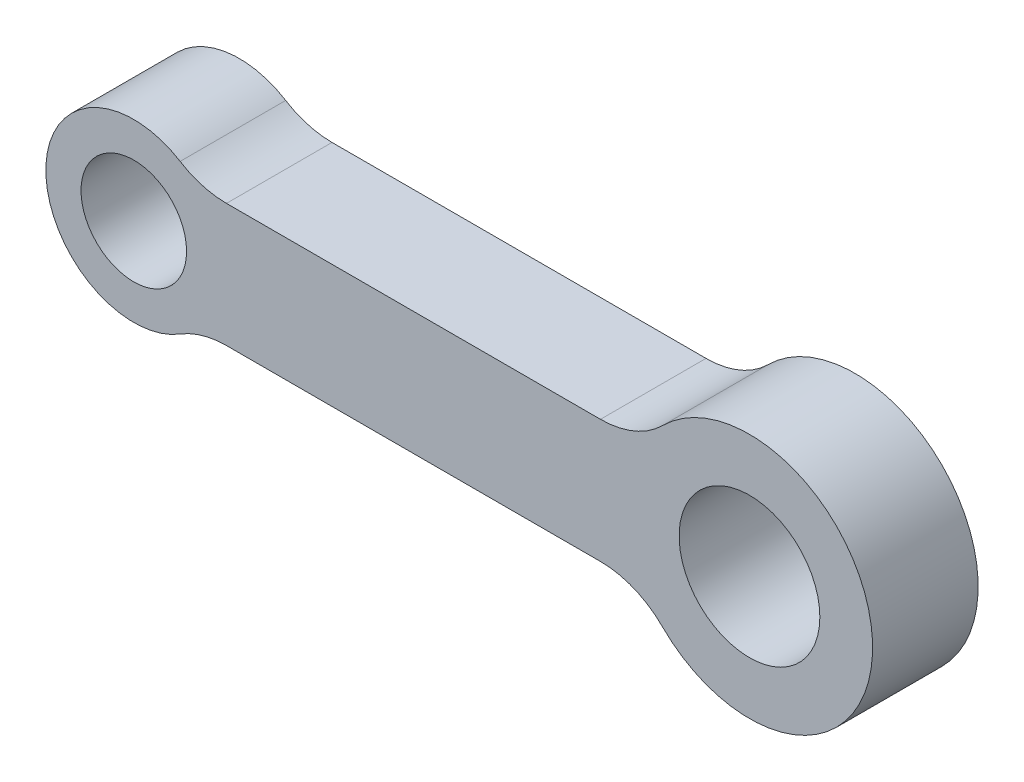
ISO-10303-21;
HEADER;
FILE_DESCRIPTION(('STEP AP214'),'2;1');
FILE_NAME('part.step','',(''),(''),'','','');
FILE_SCHEMA(('AUTOMOTIVE_DESIGN { 1 0 10303 214 1 1 1 1 }'));
ENDSEC;
DATA;
#1=APPLICATION_CONTEXT('core data for automotive mechanical design processes');
#2=APPLICATION_PROTOCOL_DEFINITION('international standard','automotive_design',2000,#1);
#3=PRODUCT_CONTEXT('',#1,'mechanical');
#4=PRODUCT('Part','Part','',(#3));
#5=PRODUCT_RELATED_PRODUCT_CATEGORY('part','',(#4));
#6=PRODUCT_DEFINITION_FORMATION('','',#4);
#7=PRODUCT_DEFINITION_CONTEXT('part definition',#1,'design');
#8=PRODUCT_DEFINITION('design','',#6,#7);
#9=PRODUCT_DEFINITION_SHAPE('','',#8);
#10=(LENGTH_UNIT() NAMED_UNIT(*) SI_UNIT(.MILLI.,.METRE.));
#11=(NAMED_UNIT(*) PLANE_ANGLE_UNIT() SI_UNIT($,.RADIAN.));
#12=(NAMED_UNIT(*) SI_UNIT($,.STERADIAN.) SOLID_ANGLE_UNIT());
#13=UNCERTAINTY_MEASURE_WITH_UNIT(LENGTH_MEASURE(1.E-05),#10,'distance_accuracy_value','');
#14=(GEOMETRIC_REPRESENTATION_CONTEXT(3) GLOBAL_UNCERTAINTY_ASSIGNED_CONTEXT((#13)) GLOBAL_UNIT_ASSIGNED_CONTEXT((#10,
#11,#12)) REPRESENTATION_CONTEXT('',''));
#15=CARTESIAN_POINT('',(0.,0.,0.));
#16=DIRECTION('',(0.,0.,1.));
#17=DIRECTION('',(1.,0.,0.));
#18=AXIS2_PLACEMENT_3D('',#15,#16,#17);
#19=CARTESIAN_POINT('',(-17.5,0.,3.));
#20=DIRECTION('',(0.,0.,-1.));
#21=DIRECTION('',(-1.,0.,0.));
#22=AXIS2_PLACEMENT_3D('',#19,#20,#21);
#23=CYLINDRICAL_SURFACE('',#22,5.);
#24=CARTESIAN_POINT('',(-17.5,0.,3.));
#25=DIRECTION('',(0.,0.,1.));
#26=DIRECTION('',(1.,0.,0.));
#27=AXIS2_PLACEMENT_3D('',#24,#25,#26);
#28=CIRCLE('',#27,5.);
#29=CARTESIAN_POINT('',(-14.8660865617868,4.25,3.));
#30=VERTEX_POINT('',#29);
#31=CARTESIAN_POINT('',(-14.8660865617868,-4.25,3.));
#32=VERTEX_POINT('',#31);
#33=EDGE_CURVE('E192',#30,#32,#28,.T.);
#34=ORIENTED_EDGE('',*,*,#33,.F.);
#35=DIRECTION('',(0.,0.,-1.));
#36=VECTOR('',#35,1.);
#37=CARTESIAN_POINT('',(-14.8660865617868,4.25,3.));
#38=LINE('',#37,#36);
#39=CARTESIAN_POINT('',(-14.8660865617868,4.25,-3.));
#40=VERTEX_POINT('',#39);
#41=EDGE_CURVE('E155',#30,#40,#38,.T.);
#42=ORIENTED_EDGE('',*,*,#41,.T.);
#43=CARTESIAN_POINT('',(-17.5,0.,-3.));
#44=DIRECTION('',(0.,0.,1.));
#45=DIRECTION('',(1.,0.,0.));
#46=AXIS2_PLACEMENT_3D('',#43,#44,#45);
#47=CIRCLE('',#46,5.);
#48=CARTESIAN_POINT('',(-14.8660865617868,-4.25,-3.));
#49=VERTEX_POINT('',#48);
#50=EDGE_CURVE('E111',#40,#49,#47,.T.);
#51=ORIENTED_EDGE('',*,*,#50,.T.);
#52=DIRECTION('',(0.,0.,-1.));
#53=VECTOR('',#52,1.);
#54=CARTESIAN_POINT('',(-14.8660865617868,-4.25,3.));
#55=LINE('',#54,#53);
#56=EDGE_CURVE('E152',#49,#32,#55,.F.);
#57=ORIENTED_EDGE('',*,*,#56,.T.);
#58=EDGE_LOOP('',(#34,#42,#51,#57));
#59=FACE_BOUND('',#58,.T.);
#60=ADVANCED_FACE('F39',(#59),#23,.T.);
#61=CARTESIAN_POINT('',(0.,-3.5,3.));
#62=DIRECTION('',(0.,1.,0.));
#63=DIRECTION('',(0.,0.,1.));
#64=AXIS2_PLACEMENT_3D('',#61,#62,#63);
#65=PLANE('',#64);
#66=DIRECTION('',(1.,0.,0.));
#67=VECTOR('',#66,1.);
#68=CARTESIAN_POINT('',(0.,-3.5,-3.));
#69=LINE('',#68,#67);
#70=CARTESIAN_POINT('',(-12.2321731235736,-3.5,-3.));
#71=VERTEX_POINT('',#70);
#72=CARTESIAN_POINT('',(9.02946282695129,-3.5,-3.));
#73=VERTEX_POINT('',#72);
#74=EDGE_CURVE('E178',#71,#73,#69,.T.);
#75=ORIENTED_EDGE('',*,*,#74,.T.);
#76=DIRECTION('',(0.,0.,1.));
#77=VECTOR('',#76,1.);
#78=CARTESIAN_POINT('',(9.02946282695129,-3.5,3.));
#79=LINE('',#78,#77);
#80=CARTESIAN_POINT('',(9.02946282695129,-3.5,3.));
#81=VERTEX_POINT('',#80);
#82=EDGE_CURVE('E55',#73,#81,#79,.T.);
#83=ORIENTED_EDGE('',*,*,#82,.T.);
#84=DIRECTION('',(1.,0.,0.));
#85=VECTOR('',#84,1.);
#86=CARTESIAN_POINT('',(0.,-3.5,3.));
#87=LINE('',#86,#85);
#88=CARTESIAN_POINT('',(-12.2321731235736,-3.5,3.));
#89=VERTEX_POINT('',#88);
#90=EDGE_CURVE('E188',#89,#81,#87,.T.);
#91=ORIENTED_EDGE('',*,*,#90,.F.);
#92=DIRECTION('',(0.,0.,1.));
#93=VECTOR('',#92,1.);
#94=CARTESIAN_POINT('',(-12.2321731235736,-3.5,-3.));
#95=LINE('',#94,#93);
#96=EDGE_CURVE('E158',#89,#71,#95,.F.);
#97=ORIENTED_EDGE('',*,*,#96,.T.);
#98=EDGE_LOOP('',(#75,#83,#91,#97));
#99=FACE_BOUND('',#98,.T.);
#100=ADVANCED_FACE('F187',(#99),#65,.F.);
#101=CARTESIAN_POINT('',(17.5,0.,3.));
#102=DIRECTION('',(0.,0.,-1.));
#103=DIRECTION('',(-1.,0.,0.));
#104=AXIS2_PLACEMENT_3D('',#101,#102,#103);
#105=CYLINDRICAL_SURFACE('',#104,7.);
#106=CARTESIAN_POINT('',(17.5,0.,-3.));
#107=DIRECTION('',(0.,0.,1.));
#108=DIRECTION('',(1.,0.,0.));
#109=AXIS2_PLACEMENT_3D('',#106,#107,#108);
#110=CIRCLE('',#109,7.);
#111=CARTESIAN_POINT('',(12.5588533157216,-4.95833333333333,-3.));
#112=VERTEX_POINT('',#111);
#113=CARTESIAN_POINT('',(12.5588533157216,4.95833333333333,-3.));
#114=VERTEX_POINT('',#113);
#115=EDGE_CURVE('E130',#112,#114,#110,.T.);
#116=ORIENTED_EDGE('',*,*,#115,.T.);
#117=DIRECTION('',(0.,0.,-1.));
#118=VECTOR('',#117,1.);
#119=CARTESIAN_POINT('',(12.5588533157216,4.95833333333333,3.));
#120=LINE('',#119,#118);
#121=CARTESIAN_POINT('',(12.5588533157216,4.95833333333333,3.));
#122=VERTEX_POINT('',#121);
#123=EDGE_CURVE('E149',#114,#122,#120,.F.);
#124=ORIENTED_EDGE('',*,*,#123,.T.);
#125=CARTESIAN_POINT('',(17.5,0.,3.));
#126=DIRECTION('',(0.,0.,1.));
#127=DIRECTION('',(1.,0.,0.));
#128=AXIS2_PLACEMENT_3D('',#125,#126,#127);
#129=CIRCLE('',#128,7.);
#130=CARTESIAN_POINT('',(12.5588533157216,-4.95833333333333,3.));
#131=VERTEX_POINT('',#130);
#132=EDGE_CURVE('E191',#131,#122,#129,.T.);
#133=ORIENTED_EDGE('',*,*,#132,.F.);
#134=DIRECTION('',(0.,0.,-1.));
#135=VECTOR('',#134,1.);
#136=CARTESIAN_POINT('',(12.5588533157216,-4.95833333333333,3.));
#137=LINE('',#136,#135);
#138=EDGE_CURVE('E139',#131,#112,#137,.T.);
#139=ORIENTED_EDGE('',*,*,#138,.T.);
#140=EDGE_LOOP('',(#116,#124,#133,#139));
#141=FACE_BOUND('',#140,.T.);
#142=ADVANCED_FACE('F214',(#141),#105,.T.);
#143=CARTESIAN_POINT('',(0.,3.5,3.));
#144=DIRECTION('',(0.,1.,0.));
#145=DIRECTION('',(0.,0.,1.));
#146=AXIS2_PLACEMENT_3D('',#143,#144,#145);
#147=PLANE('',#146);
#148=DIRECTION('',(1.,0.,0.));
#149=VECTOR('',#148,1.);
#150=CARTESIAN_POINT('',(0.,3.5,3.));
#151=LINE('',#150,#149);
#152=CARTESIAN_POINT('',(-12.2321731235736,3.5,3.));
#153=VERTEX_POINT('',#152);
#154=CARTESIAN_POINT('',(9.02946282695129,3.5,3.));
#155=VERTEX_POINT('',#154);
#156=EDGE_CURVE('E142',#153,#155,#151,.T.);
#157=ORIENTED_EDGE('',*,*,#156,.T.);
#158=DIRECTION('',(0.,0.,-1.));
#159=VECTOR('',#158,1.);
#160=CARTESIAN_POINT('',(9.02946282695129,3.5,3.));
#161=LINE('',#160,#159);
#162=CARTESIAN_POINT('',(9.02946282695129,3.5,-3.));
#163=VERTEX_POINT('',#162);
#164=EDGE_CURVE('E127',#155,#163,#161,.T.);
#165=ORIENTED_EDGE('',*,*,#164,.T.);
#166=DIRECTION('',(1.,0.,0.));
#167=VECTOR('',#166,1.);
#168=CARTESIAN_POINT('',(0.,3.5,-3.));
#169=LINE('',#168,#167);
#170=CARTESIAN_POINT('',(-12.2321731235736,3.5,-3.));
#171=VERTEX_POINT('',#170);
#172=EDGE_CURVE('E109',#171,#163,#169,.T.);
#173=ORIENTED_EDGE('',*,*,#172,.F.);
#174=DIRECTION('',(0.,0.,-1.));
#175=VECTOR('',#174,1.);
#176=CARTESIAN_POINT('',(-12.2321731235736,3.5,3.));
#177=LINE('',#176,#175);
#178=EDGE_CURVE('E124',#171,#153,#177,.F.);
#179=ORIENTED_EDGE('',*,*,#178,.T.);
#180=EDGE_LOOP('',(#157,#165,#173,#179));
#181=FACE_BOUND('',#180,.T.);
#182=ADVANCED_FACE('F123',(#181),#147,.T.);
#183=CARTESIAN_POINT('',(17.5,0.,3.));
#184=DIRECTION('',(0.,0.,-1.));
#185=DIRECTION('',(-1.,0.,0.));
#186=AXIS2_PLACEMENT_3D('',#183,#184,#185);
#187=CYLINDRICAL_SURFACE('',#186,4.);
#188=CARTESIAN_POINT('',(17.5,0.,3.));
#189=DIRECTION('',(0.,0.,1.));
#190=DIRECTION('',(1.,0.,0.));
#191=AXIS2_PLACEMENT_3D('',#188,#189,#190);
#192=CIRCLE('',#191,4.);
#193=CARTESIAN_POINT('',(21.5,0.,3.));
#194=VERTEX_POINT('',#193);
#195=EDGE_CURVE('E198',#194,#194,#192,.T.);
#196=ORIENTED_EDGE('',*,*,#195,.T.);
#197=EDGE_LOOP('',(#196));
#198=FACE_BOUND('',#197,.T.);
#199=CARTESIAN_POINT('',(17.5,0.,-3.));
#200=DIRECTION('',(0.,0.,1.));
#201=DIRECTION('',(1.,0.,0.));
#202=AXIS2_PLACEMENT_3D('',#199,#200,#201);
#203=CIRCLE('',#202,4.);
#204=CARTESIAN_POINT('',(21.5,0.,-3.));
#205=VERTEX_POINT('',#204);
#206=EDGE_CURVE('E185',#205,#205,#203,.T.);
#207=ORIENTED_EDGE('',*,*,#206,.F.);
#208=EDGE_LOOP('',(#207));
#209=FACE_BOUND('',#208,.T.);
#210=ADVANCED_FACE('F238',(#198,#209),#187,.F.);
#211=CARTESIAN_POINT('',(-17.5,0.,3.));
#212=DIRECTION('',(0.,0.,-1.));
#213=DIRECTION('',(-1.,0.,0.));
#214=AXIS2_PLACEMENT_3D('',#211,#212,#213);
#215=CYLINDRICAL_SURFACE('',#214,3.);
#216=CARTESIAN_POINT('',(-17.5,0.,3.));
#217=DIRECTION('',(0.,0.,1.));
#218=DIRECTION('',(1.,0.,0.));
#219=AXIS2_PLACEMENT_3D('',#216,#217,#218);
#220=CIRCLE('',#219,3.);
#221=CARTESIAN_POINT('',(-14.5,0.,3.));
#222=VERTEX_POINT('',#221);
#223=EDGE_CURVE('E135',#222,#222,#220,.T.);
#224=ORIENTED_EDGE('',*,*,#223,.T.);
#225=EDGE_LOOP('',(#224));
#226=FACE_BOUND('',#225,.T.);
#227=CARTESIAN_POINT('',(-17.5,0.,-3.));
#228=DIRECTION('',(0.,0.,1.));
#229=DIRECTION('',(1.,0.,0.));
#230=AXIS2_PLACEMENT_3D('',#227,#228,#229);
#231=CIRCLE('',#230,3.);
#232=CARTESIAN_POINT('',(-14.5,0.,-3.));
#233=VERTEX_POINT('',#232);
#234=EDGE_CURVE('E129',#233,#233,#231,.T.);
#235=ORIENTED_EDGE('',*,*,#234,.F.);
#236=EDGE_LOOP('',(#235));
#237=FACE_BOUND('',#236,.T.);
#238=ADVANCED_FACE('F241',(#226,#237),#215,.F.);
#239=CARTESIAN_POINT('',(0.,0.,3.));
#240=DIRECTION('',(0.,0.,1.));
#241=DIRECTION('',(1.,0.,0.));
#242=AXIS2_PLACEMENT_3D('',#239,#240,#241);
#243=PLANE('',#242);
#244=ORIENTED_EDGE('',*,*,#195,.F.);
#245=EDGE_LOOP('',(#244));
#246=FACE_BOUND('',#245,.T.);
#247=ORIENTED_EDGE('',*,*,#156,.F.);
#248=CARTESIAN_POINT('',(-12.2321731235736,8.5,3.));
#249=DIRECTION('',(0.,0.,1.));
#250=DIRECTION('',(1.,0.,0.));
#251=AXIS2_PLACEMENT_3D('',#248,#249,#250);
#252=CIRCLE('',#251,5.);
#253=EDGE_CURVE('E117',#153,#30,#252,.F.);
#254=ORIENTED_EDGE('',*,*,#253,.T.);
#255=ORIENTED_EDGE('',*,*,#33,.T.);
#256=CARTESIAN_POINT('',(-12.2321731235736,-8.5,3.));
#257=DIRECTION('',(0.,0.,1.));
#258=DIRECTION('',(1.,0.,0.));
#259=AXIS2_PLACEMENT_3D('',#256,#257,#258);
#260=CIRCLE('',#259,5.);
#261=EDGE_CURVE('E11',#32,#89,#260,.F.);
#262=ORIENTED_EDGE('',*,*,#261,.T.);
#263=ORIENTED_EDGE('',*,*,#90,.T.);
#264=CARTESIAN_POINT('',(9.02946282695129,-8.5,3.));
#265=DIRECTION('',(0.,0.,1.));
#266=DIRECTION('',(1.,0.,0.));
#267=AXIS2_PLACEMENT_3D('',#264,#265,#266);
#268=CIRCLE('',#267,5.);
#269=EDGE_CURVE('E174',#81,#131,#268,.F.);
#270=ORIENTED_EDGE('',*,*,#269,.T.);
#271=ORIENTED_EDGE('',*,*,#132,.T.);
#272=CARTESIAN_POINT('',(9.02946282695129,8.5,3.));
#273=DIRECTION('',(0.,0.,1.));
#274=DIRECTION('',(1.,0.,0.));
#275=AXIS2_PLACEMENT_3D('',#272,#273,#274);
#276=CIRCLE('',#275,5.);
#277=EDGE_CURVE('E118',#122,#155,#276,.F.);
#278=ORIENTED_EDGE('',*,*,#277,.T.);
#279=EDGE_LOOP('',(#247,#254,#255,#262,#263,#270,#271,#278));
#280=FACE_BOUND('',#279,.T.);
#281=ORIENTED_EDGE('',*,*,#223,.F.);
#282=EDGE_LOOP('',(#281));
#283=FACE_BOUND('',#282,.T.);
#284=ADVANCED_FACE('F220',(#246,#280,#283),#243,.T.);
#285=CARTESIAN_POINT('',(0.,0.,-3.));
#286=DIRECTION('',(0.,0.,1.));
#287=DIRECTION('',(1.,0.,0.));
#288=AXIS2_PLACEMENT_3D('',#285,#286,#287);
#289=PLANE('',#288);
#290=ORIENTED_EDGE('',*,*,#206,.T.);
#291=EDGE_LOOP('',(#290));
#292=FACE_BOUND('',#291,.T.);
#293=ORIENTED_EDGE('',*,*,#50,.F.);
#294=CARTESIAN_POINT('',(-12.2321731235736,8.5,-3.));
#295=DIRECTION('',(0.,0.,1.));
#296=DIRECTION('',(1.,0.,0.));
#297=AXIS2_PLACEMENT_3D('',#294,#295,#296);
#298=CIRCLE('',#297,5.);
#299=EDGE_CURVE('E105',#40,#171,#298,.T.);
#300=ORIENTED_EDGE('',*,*,#299,.T.);
#301=ORIENTED_EDGE('',*,*,#172,.T.);
#302=CARTESIAN_POINT('',(9.02946282695129,8.5,-3.));
#303=DIRECTION('',(0.,0.,1.));
#304=DIRECTION('',(1.,0.,0.));
#305=AXIS2_PLACEMENT_3D('',#302,#303,#304);
#306=CIRCLE('',#305,5.);
#307=EDGE_CURVE('E164',#163,#114,#306,.T.);
#308=ORIENTED_EDGE('',*,*,#307,.T.);
#309=ORIENTED_EDGE('',*,*,#115,.F.);
#310=CARTESIAN_POINT('',(9.02946282695129,-8.5,-3.));
#311=DIRECTION('',(0.,0.,1.));
#312=DIRECTION('',(1.,0.,0.));
#313=AXIS2_PLACEMENT_3D('',#310,#311,#312);
#314=CIRCLE('',#313,5.);
#315=EDGE_CURVE('E171',#112,#73,#314,.T.);
#316=ORIENTED_EDGE('',*,*,#315,.T.);
#317=ORIENTED_EDGE('',*,*,#74,.F.);
#318=CARTESIAN_POINT('',(-12.2321731235736,-8.5,-3.));
#319=DIRECTION('',(0.,0.,1.));
#320=DIRECTION('',(1.,0.,0.));
#321=AXIS2_PLACEMENT_3D('',#318,#319,#320);
#322=CIRCLE('',#321,5.);
#323=EDGE_CURVE('E48',#71,#49,#322,.T.);
#324=ORIENTED_EDGE('',*,*,#323,.T.);
#325=EDGE_LOOP('',(#293,#300,#301,#308,#309,#316,#317,#324));
#326=FACE_BOUND('',#325,.T.);
#327=ORIENTED_EDGE('',*,*,#234,.T.);
#328=EDGE_LOOP('',(#327));
#329=FACE_BOUND('',#328,.T.);
#330=ADVANCED_FACE('F107',(#292,#326,#329),#289,.F.);
#331=CARTESIAN_POINT('',(9.02946282695129,8.5,3.));
#332=DIRECTION('',(0.,0.,-1.));
#333=DIRECTION('',(-1.,0.,0.));
#334=AXIS2_PLACEMENT_3D('',#331,#332,#333);
#335=CYLINDRICAL_SURFACE('',#334,5.);
#336=ORIENTED_EDGE('',*,*,#277,.F.);
#337=ORIENTED_EDGE('',*,*,#123,.F.);
#338=ORIENTED_EDGE('',*,*,#307,.F.);
#339=ORIENTED_EDGE('',*,*,#164,.F.);
#340=EDGE_LOOP('',(#336,#337,#338,#339));
#341=FACE_BOUND('',#340,.T.);
#342=ADVANCED_FACE('F219',(#341),#335,.F.);
#343=CARTESIAN_POINT('',(-12.2321731235736,8.5,3.));
#344=DIRECTION('',(0.,0.,-1.));
#345=DIRECTION('',(-1.,0.,0.));
#346=AXIS2_PLACEMENT_3D('',#343,#344,#345);
#347=CYLINDRICAL_SURFACE('',#346,5.);
#348=ORIENTED_EDGE('',*,*,#253,.F.);
#349=ORIENTED_EDGE('',*,*,#178,.F.);
#350=ORIENTED_EDGE('',*,*,#299,.F.);
#351=ORIENTED_EDGE('',*,*,#41,.F.);
#352=EDGE_LOOP('',(#348,#349,#350,#351));
#353=FACE_BOUND('',#352,.T.);
#354=ADVANCED_FACE('F133',(#353),#347,.F.);
#355=CARTESIAN_POINT('',(9.02946282695129,-8.5,3.));
#356=DIRECTION('',(0.,0.,-1.));
#357=DIRECTION('',(-1.,0.,0.));
#358=AXIS2_PLACEMENT_3D('',#355,#356,#357);
#359=CYLINDRICAL_SURFACE('',#358,5.);
#360=ORIENTED_EDGE('',*,*,#269,.F.);
#361=ORIENTED_EDGE('',*,*,#82,.F.);
#362=ORIENTED_EDGE('',*,*,#315,.F.);
#363=ORIENTED_EDGE('',*,*,#138,.F.);
#364=EDGE_LOOP('',(#360,#361,#362,#363));
#365=FACE_BOUND('',#364,.T.);
#366=ADVANCED_FACE('F223',(#365),#359,.F.);
#367=CARTESIAN_POINT('',(-12.2321731235736,-8.5,3.));
#368=DIRECTION('',(0.,0.,-1.));
#369=DIRECTION('',(-1.,0.,0.));
#370=AXIS2_PLACEMENT_3D('',#367,#368,#369);
#371=CYLINDRICAL_SURFACE('',#370,5.);
#372=ORIENTED_EDGE('',*,*,#261,.F.);
#373=ORIENTED_EDGE('',*,*,#56,.F.);
#374=ORIENTED_EDGE('',*,*,#323,.F.);
#375=ORIENTED_EDGE('',*,*,#96,.F.);
#376=EDGE_LOOP('',(#372,#373,#374,#375));
#377=FACE_BOUND('',#376,.T.);
#378=ADVANCED_FACE('F41',(#377),#371,.F.);
#379=CLOSED_SHELL('',(#60,#100,#142,#182,#210,#238,#284,#330,#342,#354,#366,#378));
#380=MANIFOLD_SOLID_BREP('B2',#379);
#381=ADVANCED_BREP_SHAPE_REPRESENTATION('',(#18,#380),#14);
#382=SHAPE_DEFINITION_REPRESENTATION(#9,#381);
ENDSEC;
END-ISO-10303-21;
